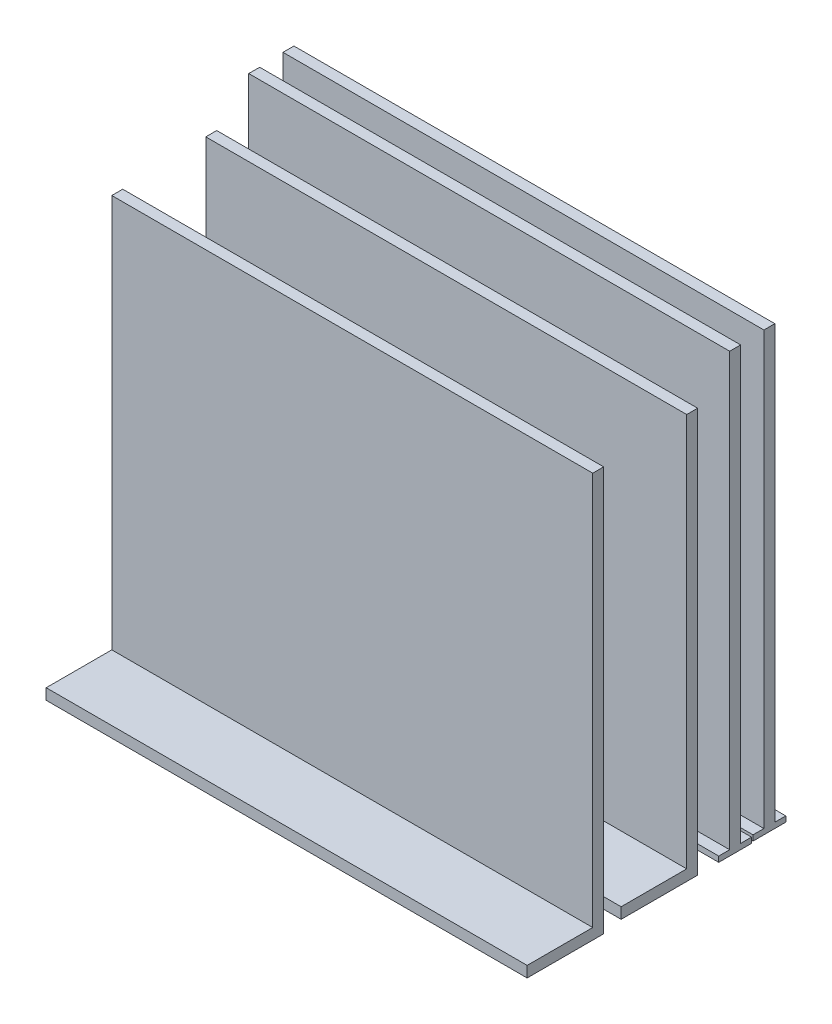
ISO-10303-21;
HEADER;
FILE_DESCRIPTION(('STEP AP214'),'2;1');
FILE_NAME('part.step','',(''),(''),'','','');
FILE_SCHEMA(('AUTOMOTIVE_DESIGN { 1 0 10303 214 1 1 1 1 }'));
ENDSEC;
DATA;
#1=APPLICATION_CONTEXT('core data for automotive mechanical design processes');
#2=APPLICATION_PROTOCOL_DEFINITION('international standard','automotive_design',2000,#1);
#3=PRODUCT_CONTEXT('',#1,'mechanical');
#4=PRODUCT('Part','Part','',(#3));
#5=PRODUCT_RELATED_PRODUCT_CATEGORY('part','',(#4));
#6=PRODUCT_DEFINITION_FORMATION('','',#4);
#7=PRODUCT_DEFINITION_CONTEXT('part definition',#1,'design');
#8=PRODUCT_DEFINITION('design','',#6,#7);
#9=PRODUCT_DEFINITION_SHAPE('','',#8);
#10=(LENGTH_UNIT() NAMED_UNIT(*) SI_UNIT(.MILLI.,.METRE.));
#11=(NAMED_UNIT(*) PLANE_ANGLE_UNIT() SI_UNIT($,.RADIAN.));
#12=(NAMED_UNIT(*) SI_UNIT($,.STERADIAN.) SOLID_ANGLE_UNIT());
#13=UNCERTAINTY_MEASURE_WITH_UNIT(LENGTH_MEASURE(1.E-05),#10,'distance_accuracy_value','');
#14=(GEOMETRIC_REPRESENTATION_CONTEXT(3) GLOBAL_UNCERTAINTY_ASSIGNED_CONTEXT((#13)) GLOBAL_UNIT_ASSIGNED_CONTEXT((#10,
#11,#12)) REPRESENTATION_CONTEXT('',''));
#15=CARTESIAN_POINT('',(0.,0.,0.));
#16=DIRECTION('',(0.,0.,1.));
#17=DIRECTION('',(1.,0.,0.));
#18=AXIS2_PLACEMENT_3D('',#15,#16,#17);
#19=CARTESIAN_POINT('',(-107.437274289821,185.,83.3800266706292));
#20=DIRECTION('',(0.,0.,-1.));
#21=DIRECTION('',(-1.,0.,0.));
#22=AXIS2_PLACEMENT_3D('',#19,#20,#21);
#23=PLANE('',#22);
#24=DIRECTION('',(-1.,0.,0.));
#25=VECTOR('',#24,1.);
#26=CARTESIAN_POINT('',(112.562725710179,5.,83.3800266706292));
#27=LINE('',#26,#25);
#28=CARTESIAN_POINT('',(112.562725710179,5.,83.3800266706292));
#29=VERTEX_POINT('',#28);
#30=CARTESIAN_POINT('',(-107.437274289821,5.,83.3800266706292));
#31=VERTEX_POINT('',#30);
#32=EDGE_CURVE('E68',#29,#31,#27,.T.);
#33=ORIENTED_EDGE('',*,*,#32,.F.);
#34=DIRECTION('',(0.,-1.,0.));
#35=VECTOR('',#34,1.);
#36=CARTESIAN_POINT('',(112.562725710179,185.,83.3800266706292));
#37=LINE('',#36,#35);
#38=CARTESIAN_POINT('',(112.562725710179,185.,83.3800266706292));
#39=VERTEX_POINT('',#38);
#40=EDGE_CURVE('E161',#39,#29,#37,.T.);
#41=ORIENTED_EDGE('',*,*,#40,.F.);
#42=DIRECTION('',(1.,0.,0.));
#43=VECTOR('',#42,1.);
#44=CARTESIAN_POINT('',(-107.437274289821,185.,83.3800266706292));
#45=LINE('',#44,#43);
#46=CARTESIAN_POINT('',(-107.437274289821,185.,83.3800266706292));
#47=VERTEX_POINT('',#46);
#48=EDGE_CURVE('E77',#47,#39,#45,.T.);
#49=ORIENTED_EDGE('',*,*,#48,.F.);
#50=DIRECTION('',(0.,-1.,0.));
#51=VECTOR('',#50,1.);
#52=CARTESIAN_POINT('',(-107.437274289821,185.,83.3800266706292));
#53=LINE('',#52,#51);
#54=EDGE_CURVE('E168',#47,#31,#53,.T.);
#55=ORIENTED_EDGE('',*,*,#54,.T.);
#56=EDGE_LOOP('',(#33,#41,#49,#55));
#57=FACE_BOUND('',#56,.T.);
#58=ADVANCED_FACE('F52',(#57),#23,.F.);
#59=CARTESIAN_POINT('',(112.562725710179,185.,78.3800266706292));
#60=DIRECTION('',(-1.,0.,0.));
#61=DIRECTION('',(0.,0.,1.));
#62=AXIS2_PLACEMENT_3D('',#59,#60,#61);
#63=PLANE('',#62);
#64=DIRECTION('',(0.,0.,-1.));
#65=VECTOR('',#64,1.);
#66=CARTESIAN_POINT('',(112.562725710179,0.,78.3800266706292));
#67=LINE('',#66,#65);
#68=CARTESIAN_POINT('',(112.562725710179,0.,113.380026670629));
#69=VERTEX_POINT('',#68);
#70=CARTESIAN_POINT('',(112.562725710179,0.,78.3800266706292));
#71=VERTEX_POINT('',#70);
#72=EDGE_CURVE('E112',#69,#71,#67,.T.);
#73=ORIENTED_EDGE('',*,*,#72,.T.);
#74=DIRECTION('',(0.,-1.,0.));
#75=VECTOR('',#74,1.);
#76=CARTESIAN_POINT('',(112.562725710179,185.,78.3800266706292));
#77=LINE('',#76,#75);
#78=CARTESIAN_POINT('',(112.562725710179,185.,78.3800266706292));
#79=VERTEX_POINT('',#78);
#80=EDGE_CURVE('E12',#79,#71,#77,.T.);
#81=ORIENTED_EDGE('',*,*,#80,.F.);
#82=DIRECTION('',(0.,0.,-1.));
#83=VECTOR('',#82,1.);
#84=CARTESIAN_POINT('',(112.562725710179,185.,78.3800266706292));
#85=LINE('',#84,#83);
#86=EDGE_CURVE('E152',#39,#79,#85,.T.);
#87=ORIENTED_EDGE('',*,*,#86,.F.);
#88=ORIENTED_EDGE('',*,*,#40,.T.);
#89=DIRECTION('',(0.,0.,-1.));
#90=VECTOR('',#89,1.);
#91=CARTESIAN_POINT('',(112.562725710179,5.,113.380026670629));
#92=LINE('',#91,#90);
#93=CARTESIAN_POINT('',(112.562725710179,5.,113.380026670629));
#94=VERTEX_POINT('',#93);
#95=EDGE_CURVE('E134',#94,#29,#92,.T.);
#96=ORIENTED_EDGE('',*,*,#95,.F.);
#97=DIRECTION('',(0.,-1.,0.));
#98=VECTOR('',#97,1.);
#99=CARTESIAN_POINT('',(112.562725710179,5.,113.380026670629));
#100=LINE('',#99,#98);
#101=EDGE_CURVE('E127',#94,#69,#100,.T.);
#102=ORIENTED_EDGE('',*,*,#101,.T.);
#103=EDGE_LOOP('',(#73,#81,#87,#88,#96,#102));
#104=FACE_BOUND('',#103,.T.);
#105=ADVANCED_FACE('F54',(#104),#63,.F.);
#106=CARTESIAN_POINT('',(-107.437274289821,185.,78.3800266706292));
#107=DIRECTION('',(0.,0.,1.));
#108=DIRECTION('',(1.,0.,0.));
#109=AXIS2_PLACEMENT_3D('',#106,#107,#108);
#110=PLANE('',#109);
#111=DIRECTION('',(-1.,0.,0.));
#112=VECTOR('',#111,1.);
#113=CARTESIAN_POINT('',(-107.437274289821,0.,78.3800266706292));
#114=LINE('',#113,#112);
#115=CARTESIAN_POINT('',(-107.437274289821,0.,78.3800266706292));
#116=VERTEX_POINT('',#115);
#117=EDGE_CURVE('E90',#71,#116,#114,.T.);
#118=ORIENTED_EDGE('',*,*,#117,.T.);
#119=DIRECTION('',(0.,-1.,0.));
#120=VECTOR('',#119,1.);
#121=CARTESIAN_POINT('',(-107.437274289821,185.,78.3800266706292));
#122=LINE('',#121,#120);
#123=CARTESIAN_POINT('',(-107.437274289821,185.,78.3800266706292));
#124=VERTEX_POINT('',#123);
#125=EDGE_CURVE('E61',#124,#116,#122,.T.);
#126=ORIENTED_EDGE('',*,*,#125,.F.);
#127=DIRECTION('',(-1.,0.,0.));
#128=VECTOR('',#127,1.);
#129=CARTESIAN_POINT('',(-107.437274289821,185.,78.3800266706292));
#130=LINE('',#129,#128);
#131=EDGE_CURVE('E95',#79,#124,#130,.T.);
#132=ORIENTED_EDGE('',*,*,#131,.F.);
#133=ORIENTED_EDGE('',*,*,#80,.T.);
#134=EDGE_LOOP('',(#118,#126,#132,#133));
#135=FACE_BOUND('',#134,.T.);
#136=ADVANCED_FACE('F175',(#135),#110,.F.);
#137=CARTESIAN_POINT('',(-107.437274289821,185.,78.3800266706292));
#138=DIRECTION('',(1.,0.,0.));
#139=DIRECTION('',(0.,0.,-1.));
#140=AXIS2_PLACEMENT_3D('',#137,#138,#139);
#141=PLANE('',#140);
#142=DIRECTION('',(0.,0.,1.));
#143=VECTOR('',#142,1.);
#144=CARTESIAN_POINT('',(-107.437274289821,0.,78.3800266706292));
#145=LINE('',#144,#143);
#146=CARTESIAN_POINT('',(-107.437274289821,0.,113.380026670629));
#147=VERTEX_POINT('',#146);
#148=EDGE_CURVE('E155',#116,#147,#145,.T.);
#149=ORIENTED_EDGE('',*,*,#148,.T.);
#150=DIRECTION('',(0.,-1.,0.));
#151=VECTOR('',#150,1.);
#152=CARTESIAN_POINT('',(-107.437274289821,5.,113.380026670629));
#153=LINE('',#152,#151);
#154=CARTESIAN_POINT('',(-107.437274289821,5.,113.380026670629));
#155=VERTEX_POINT('',#154);
#156=EDGE_CURVE('E130',#155,#147,#153,.T.);
#157=ORIENTED_EDGE('',*,*,#156,.F.);
#158=DIRECTION('',(0.,0.,1.));
#159=VECTOR('',#158,1.);
#160=CARTESIAN_POINT('',(-107.437274289821,5.,83.3800266706292));
#161=LINE('',#160,#159);
#162=EDGE_CURVE('E147',#31,#155,#161,.T.);
#163=ORIENTED_EDGE('',*,*,#162,.F.);
#164=ORIENTED_EDGE('',*,*,#54,.F.);
#165=DIRECTION('',(0.,0.,1.));
#166=VECTOR('',#165,1.);
#167=CARTESIAN_POINT('',(-107.437274289821,185.,78.3800266706292));
#168=LINE('',#167,#166);
#169=EDGE_CURVE('E157',#124,#47,#168,.T.);
#170=ORIENTED_EDGE('',*,*,#169,.F.);
#171=ORIENTED_EDGE('',*,*,#125,.T.);
#172=EDGE_LOOP('',(#149,#157,#163,#164,#170,#171));
#173=FACE_BOUND('',#172,.T.);
#174=ADVANCED_FACE('F173',(#173),#141,.F.);
#175=CARTESIAN_POINT('',(0.,185.,0.));
#176=DIRECTION('',(0.,1.,0.));
#177=DIRECTION('',(0.,0.,1.));
#178=AXIS2_PLACEMENT_3D('',#175,#176,#177);
#179=PLANE('',#178);
#180=ORIENTED_EDGE('',*,*,#86,.T.);
#181=ORIENTED_EDGE('',*,*,#131,.T.);
#182=ORIENTED_EDGE('',*,*,#169,.T.);
#183=ORIENTED_EDGE('',*,*,#48,.T.);
#184=EDGE_LOOP('',(#180,#181,#182,#183));
#185=FACE_BOUND('',#184,.T.);
#186=ADVANCED_FACE('F181',(#185),#179,.T.);
#187=CARTESIAN_POINT('',(0.,0.,0.));
#188=DIRECTION('',(0.,1.,0.));
#189=DIRECTION('',(0.,0.,1.));
#190=AXIS2_PLACEMENT_3D('',#187,#188,#189);
#191=PLANE('',#190);
#192=ORIENTED_EDGE('',*,*,#72,.F.);
#193=DIRECTION('',(1.,0.,0.));
#194=VECTOR('',#193,1.);
#195=CARTESIAN_POINT('',(-107.437274289821,0.,113.380026670629));
#196=LINE('',#195,#194);
#197=EDGE_CURVE('E116',#147,#69,#196,.T.);
#198=ORIENTED_EDGE('',*,*,#197,.F.);
#199=ORIENTED_EDGE('',*,*,#148,.F.);
#200=ORIENTED_EDGE('',*,*,#117,.F.);
#201=EDGE_LOOP('',(#192,#198,#199,#200));
#202=FACE_BOUND('',#201,.T.);
#203=ADVANCED_FACE('F114',(#202),#191,.F.);
#204=CARTESIAN_POINT('',(-107.437274289821,5.,113.380026670629));
#205=DIRECTION('',(0.,0.,-1.));
#206=DIRECTION('',(-1.,0.,0.));
#207=AXIS2_PLACEMENT_3D('',#204,#205,#206);
#208=PLANE('',#207);
#209=ORIENTED_EDGE('',*,*,#197,.T.);
#210=ORIENTED_EDGE('',*,*,#101,.F.);
#211=DIRECTION('',(1.,0.,0.));
#212=VECTOR('',#211,1.);
#213=CARTESIAN_POINT('',(-107.437274289821,5.,113.380026670629));
#214=LINE('',#213,#212);
#215=EDGE_CURVE('E140',#155,#94,#214,.T.);
#216=ORIENTED_EDGE('',*,*,#215,.F.);
#217=ORIENTED_EDGE('',*,*,#156,.T.);
#218=EDGE_LOOP('',(#209,#210,#216,#217));
#219=FACE_BOUND('',#218,.T.);
#220=ADVANCED_FACE('F125',(#219),#208,.F.);
#221=CARTESIAN_POINT('',(0.,5.,0.));
#222=DIRECTION('',(0.,1.,0.));
#223=DIRECTION('',(0.,0.,1.));
#224=AXIS2_PLACEMENT_3D('',#221,#222,#223);
#225=PLANE('',#224);
#226=ORIENTED_EDGE('',*,*,#32,.T.);
#227=ORIENTED_EDGE('',*,*,#162,.T.);
#228=ORIENTED_EDGE('',*,*,#215,.T.);
#229=ORIENTED_EDGE('',*,*,#95,.T.);
#230=EDGE_LOOP('',(#226,#227,#228,#229));
#231=FACE_BOUND('',#230,.T.);
#232=ADVANCED_FACE('F192',(#231),#225,.T.);
#233=CLOSED_SHELL('',(#58,#105,#136,#174,#186,#203,#220,#232));
#234=MANIFOLD_SOLID_BREP('B2',#233);
#235=CARTESIAN_POINT('',(-109.171443268666,185.,38.6499416309744));
#236=DIRECTION('',(0.,0.,-1.));
#237=DIRECTION('',(-1.,0.,0.));
#238=AXIS2_PLACEMENT_3D('',#235,#236,#237);
#239=PLANE('',#238);
#240=DIRECTION('',(-1.,0.,0.));
#241=VECTOR('',#240,1.);
#242=CARTESIAN_POINT('',(110.828556731334,5.,38.6499416309744));
#243=LINE('',#242,#241);
#244=CARTESIAN_POINT('',(110.828556731334,5.,38.6499416309744));
#245=VERTEX_POINT('',#244);
#246=CARTESIAN_POINT('',(-109.171443268666,5.,38.6499416309744));
#247=VERTEX_POINT('',#246);
#248=EDGE_CURVE('E305',#245,#247,#243,.T.);
#249=ORIENTED_EDGE('',*,*,#248,.F.);
#250=DIRECTION('',(0.,-1.,0.));
#251=VECTOR('',#250,1.);
#252=CARTESIAN_POINT('',(110.828556731334,185.,38.6499416309744));
#253=LINE('',#252,#251);
#254=CARTESIAN_POINT('',(110.828556731334,185.,38.6499416309744));
#255=VERTEX_POINT('',#254);
#256=EDGE_CURVE('E352',#255,#245,#253,.T.);
#257=ORIENTED_EDGE('',*,*,#256,.F.);
#258=DIRECTION('',(1.,0.,0.));
#259=VECTOR('',#258,1.);
#260=CARTESIAN_POINT('',(-109.171443268666,185.,38.6499416309744));
#261=LINE('',#260,#259);
#262=CARTESIAN_POINT('',(-109.171443268666,185.,38.6499416309744));
#263=VERTEX_POINT('',#262);
#264=EDGE_CURVE('E314',#263,#255,#261,.T.);
#265=ORIENTED_EDGE('',*,*,#264,.F.);
#266=DIRECTION('',(0.,-1.,0.));
#267=VECTOR('',#266,1.);
#268=CARTESIAN_POINT('',(-109.171443268666,185.,38.6499416309744));
#269=LINE('',#268,#267);
#270=EDGE_CURVE('E347',#263,#247,#269,.T.);
#271=ORIENTED_EDGE('',*,*,#270,.T.);
#272=EDGE_LOOP('',(#249,#257,#265,#271));
#273=FACE_BOUND('',#272,.T.);
#274=ADVANCED_FACE('F289',(#273),#239,.F.);
#275=CARTESIAN_POINT('',(110.828556731334,185.,33.6499416309744));
#276=DIRECTION('',(-1.,0.,0.));
#277=DIRECTION('',(0.,0.,1.));
#278=AXIS2_PLACEMENT_3D('',#275,#276,#277);
#279=PLANE('',#278);
#280=DIRECTION('',(0.,0.,-1.));
#281=VECTOR('',#280,1.);
#282=CARTESIAN_POINT('',(110.828556731334,0.,33.6499416309744));
#283=LINE('',#282,#281);
#284=CARTESIAN_POINT('',(110.828556731334,0.,68.6499416309744));
#285=VERTEX_POINT('',#284);
#286=CARTESIAN_POINT('',(110.828556731334,0.,33.6499416309744));
#287=VERTEX_POINT('',#286);
#288=EDGE_CURVE('E385',#285,#287,#283,.T.);
#289=ORIENTED_EDGE('',*,*,#288,.T.);
#290=DIRECTION('',(0.,-1.,0.));
#291=VECTOR('',#290,1.);
#292=CARTESIAN_POINT('',(110.828556731334,185.,33.6499416309744));
#293=LINE('',#292,#291);
#294=CARTESIAN_POINT('',(110.828556731334,185.,33.6499416309744));
#295=VERTEX_POINT('',#294);
#296=EDGE_CURVE('E50',#295,#287,#293,.T.);
#297=ORIENTED_EDGE('',*,*,#296,.F.);
#298=DIRECTION('',(0.,0.,-1.));
#299=VECTOR('',#298,1.);
#300=CARTESIAN_POINT('',(110.828556731334,185.,33.6499416309744));
#301=LINE('',#300,#299);
#302=EDGE_CURVE('E386',#255,#295,#301,.T.);
#303=ORIENTED_EDGE('',*,*,#302,.F.);
#304=ORIENTED_EDGE('',*,*,#256,.T.);
#305=DIRECTION('',(0.,0.,-1.));
#306=VECTOR('',#305,1.);
#307=CARTESIAN_POINT('',(110.828556731334,5.,68.6499416309744));
#308=LINE('',#307,#306);
#309=CARTESIAN_POINT('',(110.828556731334,5.,68.6499416309744));
#310=VERTEX_POINT('',#309);
#311=EDGE_CURVE('E367',#310,#245,#308,.T.);
#312=ORIENTED_EDGE('',*,*,#311,.F.);
#313=DIRECTION('',(0.,-1.,0.));
#314=VECTOR('',#313,1.);
#315=CARTESIAN_POINT('',(110.828556731334,5.,68.6499416309744));
#316=LINE('',#315,#314);
#317=EDGE_CURVE('E378',#310,#285,#316,.T.);
#318=ORIENTED_EDGE('',*,*,#317,.T.);
#319=EDGE_LOOP('',(#289,#297,#303,#304,#312,#318));
#320=FACE_BOUND('',#319,.T.);
#321=ADVANCED_FACE('F291',(#320),#279,.F.);
#322=CARTESIAN_POINT('',(-109.171443268666,185.,33.6499416309744));
#323=DIRECTION('',(0.,0.,1.));
#324=DIRECTION('',(1.,0.,0.));
#325=AXIS2_PLACEMENT_3D('',#322,#323,#324);
#326=PLANE('',#325);
#327=DIRECTION('',(-1.,0.,0.));
#328=VECTOR('',#327,1.);
#329=CARTESIAN_POINT('',(-109.171443268666,0.,33.6499416309744));
#330=LINE('',#329,#328);
#331=CARTESIAN_POINT('',(-109.171443268666,0.,33.6499416309744));
#332=VERTEX_POINT('',#331);
#333=EDGE_CURVE('E327',#287,#332,#330,.T.);
#334=ORIENTED_EDGE('',*,*,#333,.T.);
#335=DIRECTION('',(0.,-1.,0.));
#336=VECTOR('',#335,1.);
#337=CARTESIAN_POINT('',(-109.171443268666,185.,33.6499416309744));
#338=LINE('',#337,#336);
#339=CARTESIAN_POINT('',(-109.171443268666,185.,33.6499416309744));
#340=VERTEX_POINT('',#339);
#341=EDGE_CURVE('E298',#340,#332,#338,.T.);
#342=ORIENTED_EDGE('',*,*,#341,.F.);
#343=DIRECTION('',(-1.,0.,0.));
#344=VECTOR('',#343,1.);
#345=CARTESIAN_POINT('',(-109.171443268666,185.,33.6499416309744));
#346=LINE('',#345,#344);
#347=EDGE_CURVE('E332',#295,#340,#346,.T.);
#348=ORIENTED_EDGE('',*,*,#347,.F.);
#349=ORIENTED_EDGE('',*,*,#296,.T.);
#350=EDGE_LOOP('',(#334,#342,#348,#349));
#351=FACE_BOUND('',#350,.T.);
#352=ADVANCED_FACE('F424',(#351),#326,.F.);
#353=CARTESIAN_POINT('',(-109.171443268666,185.,33.6499416309744));
#354=DIRECTION('',(1.,0.,0.));
#355=DIRECTION('',(0.,0.,-1.));
#356=AXIS2_PLACEMENT_3D('',#353,#354,#355);
#357=PLANE('',#356);
#358=DIRECTION('',(0.,0.,1.));
#359=VECTOR('',#358,1.);
#360=CARTESIAN_POINT('',(-109.171443268666,0.,33.6499416309744));
#361=LINE('',#360,#359);
#362=CARTESIAN_POINT('',(-109.171443268666,0.,68.6499416309744));
#363=VERTEX_POINT('',#362);
#364=EDGE_CURVE('E389',#332,#363,#361,.T.);
#365=ORIENTED_EDGE('',*,*,#364,.T.);
#366=DIRECTION('',(0.,-1.,0.));
#367=VECTOR('',#366,1.);
#368=CARTESIAN_POINT('',(-109.171443268666,5.,68.6499416309744));
#369=LINE('',#368,#367);
#370=CARTESIAN_POINT('',(-109.171443268666,5.,68.6499416309744));
#371=VERTEX_POINT('',#370);
#372=EDGE_CURVE('E358',#371,#363,#369,.T.);
#373=ORIENTED_EDGE('',*,*,#372,.F.);
#374=DIRECTION('',(0.,0.,1.));
#375=VECTOR('',#374,1.);
#376=CARTESIAN_POINT('',(-109.171443268666,5.,38.6499416309744));
#377=LINE('',#376,#375);
#378=EDGE_CURVE('E355',#247,#371,#377,.T.);
#379=ORIENTED_EDGE('',*,*,#378,.F.);
#380=ORIENTED_EDGE('',*,*,#270,.F.);
#381=DIRECTION('',(0.,0.,1.));
#382=VECTOR('',#381,1.);
#383=CARTESIAN_POINT('',(-109.171443268666,185.,33.6499416309744));
#384=LINE('',#383,#382);
#385=EDGE_CURVE('E392',#340,#263,#384,.T.);
#386=ORIENTED_EDGE('',*,*,#385,.F.);
#387=ORIENTED_EDGE('',*,*,#341,.T.);
#388=EDGE_LOOP('',(#365,#373,#379,#380,#386,#387));
#389=FACE_BOUND('',#388,.T.);
#390=ADVANCED_FACE('F356',(#389),#357,.F.);
#391=CARTESIAN_POINT('',(0.,185.,0.));
#392=DIRECTION('',(0.,1.,0.));
#393=DIRECTION('',(0.,0.,1.));
#394=AXIS2_PLACEMENT_3D('',#391,#392,#393);
#395=PLANE('',#394);
#396=ORIENTED_EDGE('',*,*,#302,.T.);
#397=ORIENTED_EDGE('',*,*,#347,.T.);
#398=ORIENTED_EDGE('',*,*,#385,.T.);
#399=ORIENTED_EDGE('',*,*,#264,.T.);
#400=EDGE_LOOP('',(#396,#397,#398,#399));
#401=FACE_BOUND('',#400,.T.);
#402=ADVANCED_FACE('F416',(#401),#395,.T.);
#403=CARTESIAN_POINT('',(0.,0.,0.));
#404=DIRECTION('',(0.,1.,0.));
#405=DIRECTION('',(0.,0.,1.));
#406=AXIS2_PLACEMENT_3D('',#403,#404,#405);
#407=PLANE('',#406);
#408=ORIENTED_EDGE('',*,*,#288,.F.);
#409=DIRECTION('',(1.,0.,0.));
#410=VECTOR('',#409,1.);
#411=CARTESIAN_POINT('',(-109.171443268666,0.,68.6499416309744));
#412=LINE('',#411,#410);
#413=EDGE_CURVE('E369',#363,#285,#412,.T.);
#414=ORIENTED_EDGE('',*,*,#413,.F.);
#415=ORIENTED_EDGE('',*,*,#364,.F.);
#416=ORIENTED_EDGE('',*,*,#333,.F.);
#417=EDGE_LOOP('',(#408,#414,#415,#416));
#418=FACE_BOUND('',#417,.T.);
#419=ADVANCED_FACE('F409',(#418),#407,.F.);
#420=CARTESIAN_POINT('',(-109.171443268666,5.,68.6499416309744));
#421=DIRECTION('',(0.,0.,-1.));
#422=DIRECTION('',(-1.,0.,0.));
#423=AXIS2_PLACEMENT_3D('',#420,#421,#422);
#424=PLANE('',#423);
#425=ORIENTED_EDGE('',*,*,#413,.T.);
#426=ORIENTED_EDGE('',*,*,#317,.F.);
#427=DIRECTION('',(1.,0.,0.));
#428=VECTOR('',#427,1.);
#429=CARTESIAN_POINT('',(-109.171443268666,5.,68.6499416309744));
#430=LINE('',#429,#428);
#431=EDGE_CURVE('E362',#371,#310,#430,.T.);
#432=ORIENTED_EDGE('',*,*,#431,.F.);
#433=ORIENTED_EDGE('',*,*,#372,.T.);
#434=EDGE_LOOP('',(#425,#426,#432,#433));
#435=FACE_BOUND('',#434,.T.);
#436=ADVANCED_FACE('F412',(#435),#424,.F.);
#437=CARTESIAN_POINT('',(0.,5.,0.));
#438=DIRECTION('',(0.,1.,0.));
#439=DIRECTION('',(0.,0.,1.));
#440=AXIS2_PLACEMENT_3D('',#437,#438,#439);
#441=PLANE('',#440);
#442=ORIENTED_EDGE('',*,*,#248,.T.);
#443=ORIENTED_EDGE('',*,*,#378,.T.);
#444=ORIENTED_EDGE('',*,*,#431,.T.);
#445=ORIENTED_EDGE('',*,*,#311,.T.);
#446=EDGE_LOOP('',(#442,#443,#444,#445));
#447=FACE_BOUND('',#446,.T.);
#448=ADVANCED_FACE('F365',(#447),#441,.T.);
#449=CLOSED_SHELL('',(#274,#321,#352,#390,#402,#419,#436,#448));
#450=MANIFOLD_SOLID_BREP('B6',#449);
#451=CARTESIAN_POINT('',(-109.424765684051,200.,13.7458587385579));
#452=DIRECTION('',(0.,0.,1.));
#453=DIRECTION('',(1.,0.,0.));
#454=AXIS2_PLACEMENT_3D('',#451,#452,#453);
#455=PLANE('',#454);
#456=DIRECTION('',(1.,0.,0.));
#457=VECTOR('',#456,1.);
#458=CARTESIAN_POINT('',(110.575234315949,2.5,13.7458587385579));
#459=LINE('',#458,#457);
#460=CARTESIAN_POINT('',(-109.424765684051,2.5,13.7458587385579));
#461=VERTEX_POINT('',#460);
#462=CARTESIAN_POINT('',(110.575234315949,2.5,13.7458587385579));
#463=VERTEX_POINT('',#462);
#464=EDGE_CURVE('E540',#461,#463,#459,.T.);
#465=ORIENTED_EDGE('',*,*,#464,.F.);
#466=DIRECTION('',(0.,-1.,0.));
#467=VECTOR('',#466,1.);
#468=CARTESIAN_POINT('',(-109.424765684051,200.,13.7458587385579));
#469=LINE('',#468,#467);
#470=CARTESIAN_POINT('',(-109.424765684051,200.,13.7458587385579));
#471=VERTEX_POINT('',#470);
#472=EDGE_CURVE('E534',#471,#461,#469,.T.);
#473=ORIENTED_EDGE('',*,*,#472,.F.);
#474=DIRECTION('',(-1.,0.,0.));
#475=VECTOR('',#474,1.);
#476=CARTESIAN_POINT('',(-109.424765684051,200.,13.7458587385579));
#477=LINE('',#476,#475);
#478=CARTESIAN_POINT('',(110.575234315949,200.,13.7458587385579));
#479=VERTEX_POINT('',#478);
#480=EDGE_CURVE('E659',#479,#471,#477,.T.);
#481=ORIENTED_EDGE('',*,*,#480,.F.);
#482=DIRECTION('',(0.,-1.,0.));
#483=VECTOR('',#482,1.);
#484=CARTESIAN_POINT('',(110.575234315949,200.,13.7458587385579));
#485=LINE('',#484,#483);
#486=EDGE_CURVE('E287',#479,#463,#485,.T.);
#487=ORIENTED_EDGE('',*,*,#486,.T.);
#488=EDGE_LOOP('',(#465,#473,#481,#487));
#489=FACE_BOUND('',#488,.T.);
#490=ADVANCED_FACE('F525',(#489),#455,.F.);
#491=CARTESIAN_POINT('',(-109.424765684051,200.,18.7458587385579));
#492=DIRECTION('',(0.,0.,-1.));
#493=DIRECTION('',(-1.,0.,0.));
#494=AXIS2_PLACEMENT_3D('',#491,#492,#493);
#495=PLANE('',#494);
#496=DIRECTION('',(-1.,0.,0.));
#497=VECTOR('',#496,1.);
#498=CARTESIAN_POINT('',(110.575234315949,2.5,18.7458587385579));
#499=LINE('',#498,#497);
#500=CARTESIAN_POINT('',(110.575234315949,2.5,18.7458587385579));
#501=VERTEX_POINT('',#500);
#502=CARTESIAN_POINT('',(-109.424765684051,2.5,18.7458587385579));
#503=VERTEX_POINT('',#502);
#504=EDGE_CURVE('E548',#501,#503,#499,.T.);
#505=ORIENTED_EDGE('',*,*,#504,.F.);
#506=DIRECTION('',(0.,-1.,0.));
#507=VECTOR('',#506,1.);
#508=CARTESIAN_POINT('',(110.575234315949,200.,18.7458587385579));
#509=LINE('',#508,#507);
#510=CARTESIAN_POINT('',(110.575234315949,200.,18.7458587385579));
#511=VERTEX_POINT('',#510);
#512=EDGE_CURVE('E668',#511,#501,#509,.T.);
#513=ORIENTED_EDGE('',*,*,#512,.F.);
#514=DIRECTION('',(1.,0.,0.));
#515=VECTOR('',#514,1.);
#516=CARTESIAN_POINT('',(-109.424765684051,200.,18.7458587385579));
#517=LINE('',#516,#515);
#518=CARTESIAN_POINT('',(-109.424765684051,200.,18.7458587385579));
#519=VERTEX_POINT('',#518);
#520=EDGE_CURVE('E665',#519,#511,#517,.T.);
#521=ORIENTED_EDGE('',*,*,#520,.F.);
#522=DIRECTION('',(0.,-1.,0.));
#523=VECTOR('',#522,1.);
#524=CARTESIAN_POINT('',(-109.424765684051,200.,18.7458587385579));
#525=LINE('',#524,#523);
#526=EDGE_CURVE('E673',#519,#503,#525,.T.);
#527=ORIENTED_EDGE('',*,*,#526,.T.);
#528=EDGE_LOOP('',(#505,#513,#521,#527));
#529=FACE_BOUND('',#528,.T.);
#530=ADVANCED_FACE('F693',(#529),#495,.F.);
#531=CARTESIAN_POINT('',(110.575234315949,200.,13.7458587385579));
#532=DIRECTION('',(-1.,0.,0.));
#533=DIRECTION('',(0.,0.,1.));
#534=AXIS2_PLACEMENT_3D('',#531,#532,#533);
#535=PLANE('',#534);
#536=DIRECTION('',(0.,0.,-1.));
#537=VECTOR('',#536,1.);
#538=CARTESIAN_POINT('',(110.575234315949,0.,13.7458587385579));
#539=LINE('',#538,#537);
#540=CARTESIAN_POINT('',(110.575234315949,0.,23.7458587385579));
#541=VERTEX_POINT('',#540);
#542=CARTESIAN_POINT('',(110.575234315949,0.,8.74585873855787));
#543=VERTEX_POINT('',#542);
#544=EDGE_CURVE('E604',#541,#543,#539,.T.);
#545=ORIENTED_EDGE('',*,*,#544,.T.);
#546=DIRECTION('',(0.,-1.,0.));
#547=VECTOR('',#546,1.);
#548=CARTESIAN_POINT('',(110.575234315949,2.5,8.74585873855787));
#549=LINE('',#548,#547);
#550=CARTESIAN_POINT('',(110.575234315949,2.5,8.74585873855787));
#551=VERTEX_POINT('',#550);
#552=EDGE_CURVE('E614',#551,#543,#549,.T.);
#553=ORIENTED_EDGE('',*,*,#552,.F.);
#554=DIRECTION('',(0.,0.,-1.));
#555=VECTOR('',#554,1.);
#556=CARTESIAN_POINT('',(110.575234315949,2.5,8.74585873855787));
#557=LINE('',#556,#555);
#558=EDGE_CURVE('E632',#463,#551,#557,.T.);
#559=ORIENTED_EDGE('',*,*,#558,.F.);
#560=ORIENTED_EDGE('',*,*,#486,.F.);
#561=DIRECTION('',(0.,0.,-1.));
#562=VECTOR('',#561,1.);
#563=CARTESIAN_POINT('',(110.575234315949,200.,13.7458587385579));
#564=LINE('',#563,#562);
#565=EDGE_CURVE('E603',#511,#479,#564,.T.);
#566=ORIENTED_EDGE('',*,*,#565,.F.);
#567=ORIENTED_EDGE('',*,*,#512,.T.);
#568=DIRECTION('',(0.,0.,-1.));
#569=VECTOR('',#568,1.);
#570=CARTESIAN_POINT('',(110.575234315949,2.5,23.7458587385579));
#571=LINE('',#570,#569);
#572=CARTESIAN_POINT('',(110.575234315949,2.5,23.7458587385579));
#573=VERTEX_POINT('',#572);
#574=EDGE_CURVE('E644',#573,#501,#571,.T.);
#575=ORIENTED_EDGE('',*,*,#574,.F.);
#576=DIRECTION('',(0.,-1.,0.));
#577=VECTOR('',#576,1.);
#578=CARTESIAN_POINT('',(110.575234315949,2.5,23.7458587385579));
#579=LINE('',#578,#577);
#580=EDGE_CURVE('E648',#573,#541,#579,.T.);
#581=ORIENTED_EDGE('',*,*,#580,.T.);
#582=EDGE_LOOP('',(#545,#553,#559,#560,#566,#567,#575,#581));
#583=FACE_BOUND('',#582,.T.);
#584=ADVANCED_FACE('F527',(#583),#535,.F.);
#585=CARTESIAN_POINT('',(-109.424765684051,200.,13.7458587385579));
#586=DIRECTION('',(1.,0.,0.));
#587=DIRECTION('',(0.,0.,-1.));
#588=AXIS2_PLACEMENT_3D('',#585,#586,#587);
#589=PLANE('',#588);
#590=DIRECTION('',(0.,0.,1.));
#591=VECTOR('',#590,1.);
#592=CARTESIAN_POINT('',(-109.424765684051,0.,13.7458587385579));
#593=LINE('',#592,#591);
#594=CARTESIAN_POINT('',(-109.424765684051,0.,8.74585873855787));
#595=VERTEX_POINT('',#594);
#596=CARTESIAN_POINT('',(-109.424765684051,0.,23.7458587385579));
#597=VERTEX_POINT('',#596);
#598=EDGE_CURVE('E592',#595,#597,#593,.T.);
#599=ORIENTED_EDGE('',*,*,#598,.T.);
#600=DIRECTION('',(0.,-1.,0.));
#601=VECTOR('',#600,1.);
#602=CARTESIAN_POINT('',(-109.424765684051,2.5,23.7458587385579));
#603=LINE('',#602,#601);
#604=CARTESIAN_POINT('',(-109.424765684051,2.5,23.7458587385579));
#605=VERTEX_POINT('',#604);
#606=EDGE_CURVE('E653',#605,#597,#603,.T.);
#607=ORIENTED_EDGE('',*,*,#606,.F.);
#608=DIRECTION('',(0.,0.,1.));
#609=VECTOR('',#608,1.);
#610=CARTESIAN_POINT('',(-109.424765684051,2.5,18.7458587385579));
#611=LINE('',#610,#609);
#612=EDGE_CURVE('E639',#503,#605,#611,.T.);
#613=ORIENTED_EDGE('',*,*,#612,.F.);
#614=ORIENTED_EDGE('',*,*,#526,.F.);
#615=DIRECTION('',(0.,0.,1.));
#616=VECTOR('',#615,1.);
#617=CARTESIAN_POINT('',(-109.424765684051,200.,13.7458587385579));
#618=LINE('',#617,#616);
#619=EDGE_CURVE('E662',#471,#519,#618,.T.);
#620=ORIENTED_EDGE('',*,*,#619,.F.);
#621=ORIENTED_EDGE('',*,*,#472,.T.);
#622=DIRECTION('',(0.,0.,1.));
#623=VECTOR('',#622,1.);
#624=CARTESIAN_POINT('',(-109.424765684051,2.5,13.7458587385579));
#625=LINE('',#624,#623);
#626=CARTESIAN_POINT('',(-109.424765684051,2.5,8.74585873855787));
#627=VERTEX_POINT('',#626);
#628=EDGE_CURVE('E619',#627,#461,#625,.T.);
#629=ORIENTED_EDGE('',*,*,#628,.F.);
#630=DIRECTION('',(0.,-1.,0.));
#631=VECTOR('',#630,1.);
#632=CARTESIAN_POINT('',(-109.424765684051,2.5,8.74585873855787));
#633=LINE('',#632,#631);
#634=EDGE_CURVE('E611',#627,#595,#633,.T.);
#635=ORIENTED_EDGE('',*,*,#634,.T.);
#636=EDGE_LOOP('',(#599,#607,#613,#614,#620,#621,#629,#635));
#637=FACE_BOUND('',#636,.T.);
#638=ADVANCED_FACE('F617',(#637),#589,.F.);
#639=CARTESIAN_POINT('',(0.,200.,0.));
#640=DIRECTION('',(0.,1.,0.));
#641=DIRECTION('',(0.,0.,1.));
#642=AXIS2_PLACEMENT_3D('',#639,#640,#641);
#643=PLANE('',#642);
#644=ORIENTED_EDGE('',*,*,#565,.T.);
#645=ORIENTED_EDGE('',*,*,#480,.T.);
#646=ORIENTED_EDGE('',*,*,#619,.T.);
#647=ORIENTED_EDGE('',*,*,#520,.T.);
#648=EDGE_LOOP('',(#644,#645,#646,#647));
#649=FACE_BOUND('',#648,.T.);
#650=ADVANCED_FACE('F695',(#649),#643,.T.);
#651=CARTESIAN_POINT('',(0.,0.,0.));
#652=DIRECTION('',(0.,1.,0.));
#653=DIRECTION('',(0.,0.,1.));
#654=AXIS2_PLACEMENT_3D('',#651,#652,#653);
#655=PLANE('',#654);
#656=ORIENTED_EDGE('',*,*,#544,.F.);
#657=DIRECTION('',(1.,0.,0.));
#658=VECTOR('',#657,1.);
#659=CARTESIAN_POINT('',(-109.424765684051,0.,23.7458587385579));
#660=LINE('',#659,#658);
#661=EDGE_CURVE('E597',#597,#541,#660,.T.);
#662=ORIENTED_EDGE('',*,*,#661,.F.);
#663=ORIENTED_EDGE('',*,*,#598,.F.);
#664=DIRECTION('',(-1.,0.,0.));
#665=VECTOR('',#664,1.);
#666=CARTESIAN_POINT('',(-109.424765684051,0.,8.74585873855787));
#667=LINE('',#666,#665);
#668=EDGE_CURVE('E595',#543,#595,#667,.T.);
#669=ORIENTED_EDGE('',*,*,#668,.F.);
#670=EDGE_LOOP('',(#656,#662,#663,#669));
#671=FACE_BOUND('',#670,.T.);
#672=ADVANCED_FACE('F594',(#671),#655,.F.);
#673=CARTESIAN_POINT('',(-109.424765684051,2.5,23.7458587385579));
#674=DIRECTION('',(0.,0.,-1.));
#675=DIRECTION('',(-1.,0.,0.));
#676=AXIS2_PLACEMENT_3D('',#673,#674,#675);
#677=PLANE('',#676);
#678=ORIENTED_EDGE('',*,*,#661,.T.);
#679=ORIENTED_EDGE('',*,*,#580,.F.);
#680=DIRECTION('',(1.,0.,0.));
#681=VECTOR('',#680,1.);
#682=CARTESIAN_POINT('',(-109.424765684051,2.5,23.7458587385579));
#683=LINE('',#682,#681);
#684=EDGE_CURVE('E641',#605,#573,#683,.T.);
#685=ORIENTED_EDGE('',*,*,#684,.F.);
#686=ORIENTED_EDGE('',*,*,#606,.T.);
#687=EDGE_LOOP('',(#678,#679,#685,#686));
#688=FACE_BOUND('',#687,.T.);
#689=ADVANCED_FACE('F686',(#688),#677,.F.);
#690=CARTESIAN_POINT('',(0.,2.5,0.));
#691=DIRECTION('',(0.,1.,0.));
#692=DIRECTION('',(0.,0.,1.));
#693=AXIS2_PLACEMENT_3D('',#690,#691,#692);
#694=PLANE('',#693);
#695=ORIENTED_EDGE('',*,*,#504,.T.);
#696=ORIENTED_EDGE('',*,*,#612,.T.);
#697=ORIENTED_EDGE('',*,*,#684,.T.);
#698=ORIENTED_EDGE('',*,*,#574,.T.);
#699=EDGE_LOOP('',(#695,#696,#697,#698));
#700=FACE_BOUND('',#699,.T.);
#701=ADVANCED_FACE('F691',(#700),#694,.T.);
#702=CARTESIAN_POINT('',(-109.424765684051,2.5,8.74585873855787));
#703=DIRECTION('',(0.,0.,1.));
#704=DIRECTION('',(1.,0.,0.));
#705=AXIS2_PLACEMENT_3D('',#702,#703,#704);
#706=PLANE('',#705);
#707=ORIENTED_EDGE('',*,*,#668,.T.);
#708=ORIENTED_EDGE('',*,*,#634,.F.);
#709=DIRECTION('',(-1.,0.,0.));
#710=VECTOR('',#709,1.);
#711=CARTESIAN_POINT('',(-109.424765684051,2.5,8.74585873855787));
#712=LINE('',#711,#710);
#713=EDGE_CURVE('E625',#551,#627,#712,.T.);
#714=ORIENTED_EDGE('',*,*,#713,.F.);
#715=ORIENTED_EDGE('',*,*,#552,.T.);
#716=EDGE_LOOP('',(#707,#708,#714,#715));
#717=FACE_BOUND('',#716,.T.);
#718=ADVANCED_FACE('F609',(#717),#706,.F.);
#719=CARTESIAN_POINT('',(0.,2.5,0.));
#720=DIRECTION('',(0.,-1.,0.));
#721=DIRECTION('',(0.,0.,-1.));
#722=AXIS2_PLACEMENT_3D('',#719,#720,#721);
#723=PLANE('',#722);
#724=ORIENTED_EDGE('',*,*,#464,.T.);
#725=ORIENTED_EDGE('',*,*,#558,.T.);
#726=ORIENTED_EDGE('',*,*,#713,.T.);
#727=ORIENTED_EDGE('',*,*,#628,.T.);
#728=EDGE_LOOP('',(#724,#725,#726,#727));
#729=FACE_BOUND('',#728,.T.);
#730=ADVANCED_FACE('F679',(#729),#723,.F.);
#731=CLOSED_SHELL('',(#490,#530,#584,#638,#650,#672,#689,#701,#718,#730));
#732=MANIFOLD_SOLID_BREP('B44',#731);
#733=CARTESIAN_POINT('',(-110.,200.,-2.5));
#734=DIRECTION('',(0.,0.,1.));
#735=DIRECTION('',(1.,0.,0.));
#736=AXIS2_PLACEMENT_3D('',#733,#734,#735);
#737=PLANE('',#736);
#738=DIRECTION('',(1.,0.,0.));
#739=VECTOR('',#738,1.);
#740=CARTESIAN_POINT('',(110.,2.5,-2.5));
#741=LINE('',#740,#739);
#742=CARTESIAN_POINT('',(-110.,2.5,-2.5));
#743=VERTEX_POINT('',#742);
#744=CARTESIAN_POINT('',(110.,2.5,-2.5));
#745=VERTEX_POINT('',#744);
#746=EDGE_CURVE('E840',#743,#745,#741,.T.);
#747=ORIENTED_EDGE('',*,*,#746,.F.);
#748=DIRECTION('',(0.,-1.,0.));
#749=VECTOR('',#748,1.);
#750=CARTESIAN_POINT('',(-110.,200.,-2.5));
#751=LINE('',#750,#749);
#752=CARTESIAN_POINT('',(-110.,200.,-2.5));
#753=VERTEX_POINT('',#752);
#754=EDGE_CURVE('E834',#753,#743,#751,.T.);
#755=ORIENTED_EDGE('',*,*,#754,.F.);
#756=DIRECTION('',(-1.,0.,0.));
#757=VECTOR('',#756,1.);
#758=CARTESIAN_POINT('',(-110.,200.,-2.5));
#759=LINE('',#758,#757);
#760=CARTESIAN_POINT('',(110.,200.,-2.5));
#761=VERTEX_POINT('',#760);
#762=EDGE_CURVE('E960',#761,#753,#759,.T.);
#763=ORIENTED_EDGE('',*,*,#762,.F.);
#764=DIRECTION('',(0.,-1.,0.));
#765=VECTOR('',#764,1.);
#766=CARTESIAN_POINT('',(110.,200.,-2.5));
#767=LINE('',#766,#765);
#768=EDGE_CURVE('E523',#761,#745,#767,.T.);
#769=ORIENTED_EDGE('',*,*,#768,.T.);
#770=EDGE_LOOP('',(#747,#755,#763,#769));
#771=FACE_BOUND('',#770,.T.);
#772=ADVANCED_FACE('F825',(#771),#737,.F.);
#773=CARTESIAN_POINT('',(-110.,200.,2.5));
#774=DIRECTION('',(0.,0.,-1.));
#775=DIRECTION('',(-1.,0.,0.));
#776=AXIS2_PLACEMENT_3D('',#773,#774,#775);
#777=PLANE('',#776);
#778=DIRECTION('',(-1.,0.,0.));
#779=VECTOR('',#778,1.);
#780=CARTESIAN_POINT('',(110.,2.5,2.5));
#781=LINE('',#780,#779);
#782=CARTESIAN_POINT('',(110.,2.5,2.5));
#783=VERTEX_POINT('',#782);
#784=CARTESIAN_POINT('',(-110.,2.5,2.5));
#785=VERTEX_POINT('',#784);
#786=EDGE_CURVE('E848',#783,#785,#781,.T.);
#787=ORIENTED_EDGE('',*,*,#786,.F.);
#788=DIRECTION('',(0.,-1.,0.));
#789=VECTOR('',#788,1.);
#790=CARTESIAN_POINT('',(110.,200.,2.5));
#791=LINE('',#790,#789);
#792=CARTESIAN_POINT('',(110.,200.,2.5));
#793=VERTEX_POINT('',#792);
#794=EDGE_CURVE('E969',#793,#783,#791,.T.);
#795=ORIENTED_EDGE('',*,*,#794,.F.);
#796=DIRECTION('',(1.,0.,0.));
#797=VECTOR('',#796,1.);
#798=CARTESIAN_POINT('',(-110.,200.,2.5));
#799=LINE('',#798,#797);
#800=CARTESIAN_POINT('',(-110.,200.,2.5));
#801=VERTEX_POINT('',#800);
#802=EDGE_CURVE('E966',#801,#793,#799,.T.);
#803=ORIENTED_EDGE('',*,*,#802,.F.);
#804=DIRECTION('',(0.,-1.,0.));
#805=VECTOR('',#804,1.);
#806=CARTESIAN_POINT('',(-110.,200.,2.5));
#807=LINE('',#806,#805);
#808=EDGE_CURVE('E973',#801,#785,#807,.T.);
#809=ORIENTED_EDGE('',*,*,#808,.T.);
#810=EDGE_LOOP('',(#787,#795,#803,#809));
#811=FACE_BOUND('',#810,.T.);
#812=ADVANCED_FACE('F993',(#811),#777,.F.);
#813=CARTESIAN_POINT('',(110.,200.,-2.5));
#814=DIRECTION('',(-1.,0.,0.));
#815=DIRECTION('',(0.,0.,1.));
#816=AXIS2_PLACEMENT_3D('',#813,#814,#815);
#817=PLANE('',#816);
#818=DIRECTION('',(0.,0.,-1.));
#819=VECTOR('',#818,1.);
#820=CARTESIAN_POINT('',(110.,0.,-2.5));
#821=LINE('',#820,#819);
#822=CARTESIAN_POINT('',(110.,0.,7.5));
#823=VERTEX_POINT('',#822);
#824=CARTESIAN_POINT('',(110.,0.,-7.5));
#825=VERTEX_POINT('',#824);
#826=EDGE_CURVE('E904',#823,#825,#821,.T.);
#827=ORIENTED_EDGE('',*,*,#826,.T.);
#828=DIRECTION('',(0.,-1.,0.));
#829=VECTOR('',#828,1.);
#830=CARTESIAN_POINT('',(110.,2.5,-7.5));
#831=LINE('',#830,#829);
#832=CARTESIAN_POINT('',(110.,2.5,-7.5));
#833=VERTEX_POINT('',#832);
#834=EDGE_CURVE('E914',#833,#825,#831,.T.);
#835=ORIENTED_EDGE('',*,*,#834,.F.);
#836=DIRECTION('',(0.,0.,-1.));
#837=VECTOR('',#836,1.);
#838=CARTESIAN_POINT('',(110.,2.5,-7.5));
#839=LINE('',#838,#837);
#840=EDGE_CURVE('E933',#745,#833,#839,.T.);
#841=ORIENTED_EDGE('',*,*,#840,.F.);
#842=ORIENTED_EDGE('',*,*,#768,.F.);
#843=DIRECTION('',(0.,0.,-1.));
#844=VECTOR('',#843,1.);
#845=CARTESIAN_POINT('',(110.,200.,-2.5));
#846=LINE('',#845,#844);
#847=EDGE_CURVE('E903',#793,#761,#846,.T.);
#848=ORIENTED_EDGE('',*,*,#847,.F.);
#849=ORIENTED_EDGE('',*,*,#794,.T.);
#850=DIRECTION('',(0.,0.,-1.));
#851=VECTOR('',#850,1.);
#852=CARTESIAN_POINT('',(110.,2.5,7.5));
#853=LINE('',#852,#851);
#854=CARTESIAN_POINT('',(110.,2.5,7.5));
#855=VERTEX_POINT('',#854);
#856=EDGE_CURVE('E944',#855,#783,#853,.T.);
#857=ORIENTED_EDGE('',*,*,#856,.F.);
#858=DIRECTION('',(0.,-1.,0.));
#859=VECTOR('',#858,1.);
#860=CARTESIAN_POINT('',(110.,2.5,7.5));
#861=LINE('',#860,#859);
#862=EDGE_CURVE('E940',#855,#823,#861,.T.);
#863=ORIENTED_EDGE('',*,*,#862,.T.);
#864=EDGE_LOOP('',(#827,#835,#841,#842,#848,#849,#857,#863));
#865=FACE_BOUND('',#864,.T.);
#866=ADVANCED_FACE('F827',(#865),#817,.F.);
#867=CARTESIAN_POINT('',(-110.,200.,-2.5));
#868=DIRECTION('',(1.,0.,0.));
#869=DIRECTION('',(0.,0.,-1.));
#870=AXIS2_PLACEMENT_3D('',#867,#868,#869);
#871=PLANE('',#870);
#872=DIRECTION('',(0.,0.,1.));
#873=VECTOR('',#872,1.);
#874=CARTESIAN_POINT('',(-110.,0.,-2.5));
#875=LINE('',#874,#873);
#876=CARTESIAN_POINT('',(-110.,0.,-7.5));
#877=VERTEX_POINT('',#876);
#878=CARTESIAN_POINT('',(-110.,0.,7.5));
#879=VERTEX_POINT('',#878);
#880=EDGE_CURVE('E892',#877,#879,#875,.T.);
#881=ORIENTED_EDGE('',*,*,#880,.T.);
#882=DIRECTION('',(0.,-1.,0.));
#883=VECTOR('',#882,1.);
#884=CARTESIAN_POINT('',(-110.,2.5,7.5));
#885=LINE('',#884,#883);
#886=CARTESIAN_POINT('',(-110.,2.5,7.5));
#887=VERTEX_POINT('',#886);
#888=EDGE_CURVE('E916',#887,#879,#885,.T.);
#889=ORIENTED_EDGE('',*,*,#888,.F.);
#890=DIRECTION('',(0.,0.,1.));
#891=VECTOR('',#890,1.);
#892=CARTESIAN_POINT('',(-110.,2.5,2.5));
#893=LINE('',#892,#891);
#894=EDGE_CURVE('E953',#785,#887,#893,.T.);
#895=ORIENTED_EDGE('',*,*,#894,.F.);
#896=ORIENTED_EDGE('',*,*,#808,.F.);
#897=DIRECTION('',(0.,0.,1.));
#898=VECTOR('',#897,1.);
#899=CARTESIAN_POINT('',(-110.,200.,-2.5));
#900=LINE('',#899,#898);
#901=EDGE_CURVE('E963',#753,#801,#900,.T.);
#902=ORIENTED_EDGE('',*,*,#901,.F.);
#903=ORIENTED_EDGE('',*,*,#754,.T.);
#904=DIRECTION('',(0.,0.,1.));
#905=VECTOR('',#904,1.);
#906=CARTESIAN_POINT('',(-110.,2.5,-2.5));
#907=LINE('',#906,#905);
#908=CARTESIAN_POINT('',(-110.,2.5,-7.5));
#909=VERTEX_POINT('',#908);
#910=EDGE_CURVE('E920',#909,#743,#907,.T.);
#911=ORIENTED_EDGE('',*,*,#910,.F.);
#912=DIRECTION('',(0.,-1.,0.));
#913=VECTOR('',#912,1.);
#914=CARTESIAN_POINT('',(-110.,2.5,-7.5));
#915=LINE('',#914,#913);
#916=EDGE_CURVE('E911',#909,#877,#915,.T.);
#917=ORIENTED_EDGE('',*,*,#916,.T.);
#918=EDGE_LOOP('',(#881,#889,#895,#896,#902,#903,#911,#917));
#919=FACE_BOUND('',#918,.T.);
#920=ADVANCED_FACE('F918',(#919),#871,.F.);
#921=CARTESIAN_POINT('',(0.,200.,0.));
#922=DIRECTION('',(0.,1.,0.));
#923=DIRECTION('',(0.,0.,1.));
#924=AXIS2_PLACEMENT_3D('',#921,#922,#923);
#925=PLANE('',#924);
#926=ORIENTED_EDGE('',*,*,#847,.T.);
#927=ORIENTED_EDGE('',*,*,#762,.T.);
#928=ORIENTED_EDGE('',*,*,#901,.T.);
#929=ORIENTED_EDGE('',*,*,#802,.T.);
#930=EDGE_LOOP('',(#926,#927,#928,#929));
#931=FACE_BOUND('',#930,.T.);
#932=ADVANCED_FACE('F995',(#931),#925,.T.);
#933=CARTESIAN_POINT('',(0.,0.,0.));
#934=DIRECTION('',(0.,1.,0.));
#935=DIRECTION('',(0.,0.,1.));
#936=AXIS2_PLACEMENT_3D('',#933,#934,#935);
#937=PLANE('',#936);
#938=ORIENTED_EDGE('',*,*,#826,.F.);
#939=DIRECTION('',(1.,0.,0.));
#940=VECTOR('',#939,1.);
#941=CARTESIAN_POINT('',(-110.,0.,7.5));
#942=LINE('',#941,#940);
#943=EDGE_CURVE('E897',#879,#823,#942,.T.);
#944=ORIENTED_EDGE('',*,*,#943,.F.);
#945=ORIENTED_EDGE('',*,*,#880,.F.);
#946=DIRECTION('',(-1.,0.,0.));
#947=VECTOR('',#946,1.);
#948=CARTESIAN_POINT('',(-110.,0.,-7.5));
#949=LINE('',#948,#947);
#950=EDGE_CURVE('E895',#825,#877,#949,.T.);
#951=ORIENTED_EDGE('',*,*,#950,.F.);
#952=EDGE_LOOP('',(#938,#944,#945,#951));
#953=FACE_BOUND('',#952,.T.);
#954=ADVANCED_FACE('F894',(#953),#937,.F.);
#955=CARTESIAN_POINT('',(-110.,2.5,7.5));
#956=DIRECTION('',(0.,0.,-1.));
#957=DIRECTION('',(-1.,0.,0.));
#958=AXIS2_PLACEMENT_3D('',#955,#956,#957);
#959=PLANE('',#958);
#960=ORIENTED_EDGE('',*,*,#943,.T.);
#961=ORIENTED_EDGE('',*,*,#862,.F.);
#962=DIRECTION('',(1.,0.,0.));
#963=VECTOR('',#962,1.);
#964=CARTESIAN_POINT('',(-110.,2.5,7.5));
#965=LINE('',#964,#963);
#966=EDGE_CURVE('E950',#887,#855,#965,.T.);
#967=ORIENTED_EDGE('',*,*,#966,.F.);
#968=ORIENTED_EDGE('',*,*,#888,.T.);
#969=EDGE_LOOP('',(#960,#961,#967,#968));
#970=FACE_BOUND('',#969,.T.);
#971=ADVANCED_FACE('F986',(#970),#959,.F.);
#972=CARTESIAN_POINT('',(0.,2.5,0.));
#973=DIRECTION('',(0.,1.,0.));
#974=DIRECTION('',(0.,0.,1.));
#975=AXIS2_PLACEMENT_3D('',#972,#973,#974);
#976=PLANE('',#975);
#977=ORIENTED_EDGE('',*,*,#786,.T.);
#978=ORIENTED_EDGE('',*,*,#894,.T.);
#979=ORIENTED_EDGE('',*,*,#966,.T.);
#980=ORIENTED_EDGE('',*,*,#856,.T.);
#981=EDGE_LOOP('',(#977,#978,#979,#980));
#982=FACE_BOUND('',#981,.T.);
#983=ADVANCED_FACE('F991',(#982),#976,.T.);
#984=CARTESIAN_POINT('',(-110.,2.5,-7.5));
#985=DIRECTION('',(0.,0.,1.));
#986=DIRECTION('',(1.,0.,0.));
#987=AXIS2_PLACEMENT_3D('',#984,#985,#986);
#988=PLANE('',#987);
#989=ORIENTED_EDGE('',*,*,#950,.T.);
#990=ORIENTED_EDGE('',*,*,#916,.F.);
#991=DIRECTION('',(-1.,0.,0.));
#992=VECTOR('',#991,1.);
#993=CARTESIAN_POINT('',(-110.,2.5,-7.5));
#994=LINE('',#993,#992);
#995=EDGE_CURVE('E926',#833,#909,#994,.T.);
#996=ORIENTED_EDGE('',*,*,#995,.F.);
#997=ORIENTED_EDGE('',*,*,#834,.T.);
#998=EDGE_LOOP('',(#989,#990,#996,#997));
#999=FACE_BOUND('',#998,.T.);
#1000=ADVANCED_FACE('F909',(#999),#988,.F.);
#1001=CARTESIAN_POINT('',(0.,2.5,0.));
#1002=DIRECTION('',(0.,-1.,0.));
#1003=DIRECTION('',(0.,0.,-1.));
#1004=AXIS2_PLACEMENT_3D('',#1001,#1002,#1003);
#1005=PLANE('',#1004);
#1006=ORIENTED_EDGE('',*,*,#746,.T.);
#1007=ORIENTED_EDGE('',*,*,#840,.T.);
#1008=ORIENTED_EDGE('',*,*,#995,.T.);
#1009=ORIENTED_EDGE('',*,*,#910,.T.);
#1010=EDGE_LOOP('',(#1006,#1007,#1008,#1009));
#1011=FACE_BOUND('',#1010,.T.);
#1012=ADVANCED_FACE('F979',(#1011),#1005,.F.);
#1013=CLOSED_SHELL('',(#772,#812,#866,#920,#932,#954,#971,#983,#1000,#1012));
#1014=MANIFOLD_SOLID_BREP('B281',#1013);
#1015=ADVANCED_BREP_SHAPE_REPRESENTATION('',(#18,#234,#450,#732,#1014),#14);
#1016=SHAPE_DEFINITION_REPRESENTATION(#9,#1015);
ENDSEC;
END-ISO-10303-21;
